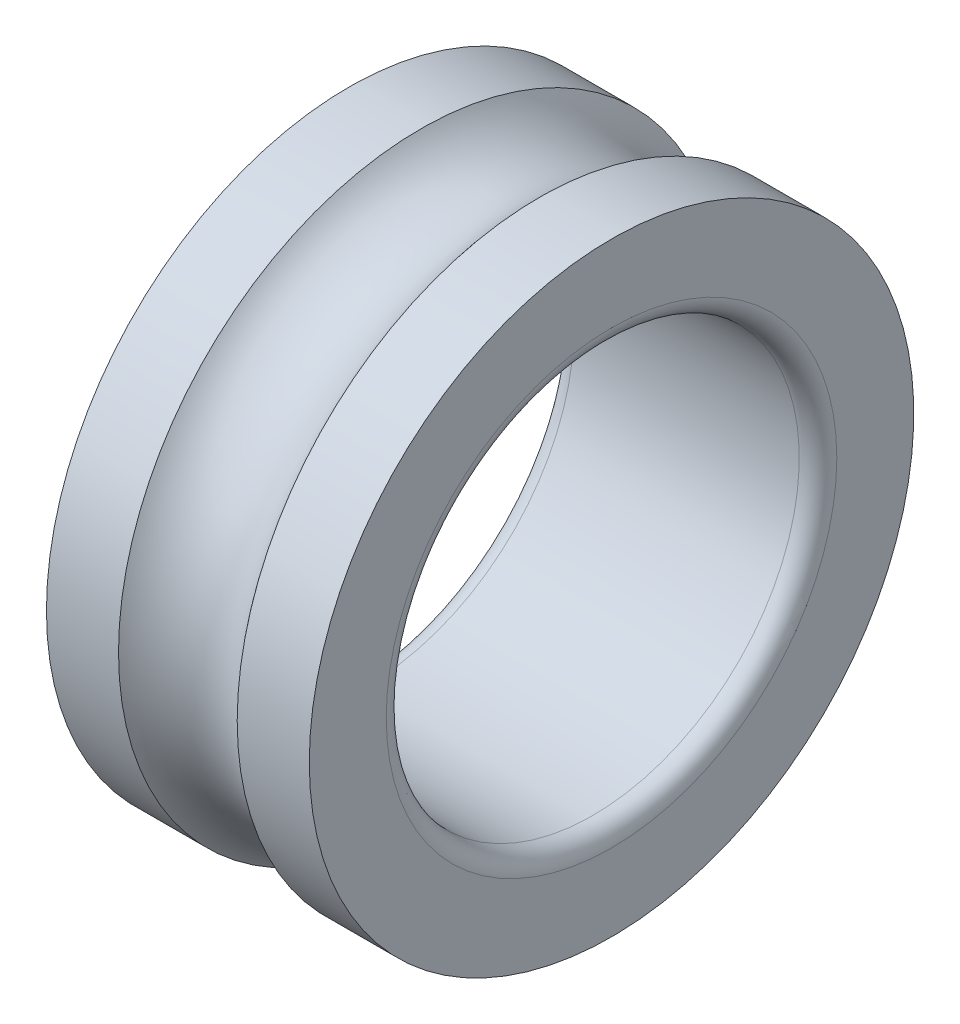
ISO-10303-21;
HEADER;
FILE_DESCRIPTION(('STEP AP214'),'2;1');
FILE_NAME('part.step','',(''),(''),'','','');
FILE_SCHEMA(('AUTOMOTIVE_DESIGN { 1 0 10303 214 1 1 1 1 }'));
ENDSEC;
DATA;
#1=APPLICATION_CONTEXT('core data for automotive mechanical design processes');
#2=APPLICATION_PROTOCOL_DEFINITION('international standard','automotive_design',2000,#1);
#3=PRODUCT_CONTEXT('',#1,'mechanical');
#4=PRODUCT('Part','Part','',(#3));
#5=PRODUCT_RELATED_PRODUCT_CATEGORY('part','',(#4));
#6=PRODUCT_DEFINITION_FORMATION('','',#4);
#7=PRODUCT_DEFINITION_CONTEXT('part definition',#1,'design');
#8=PRODUCT_DEFINITION('design','',#6,#7);
#9=PRODUCT_DEFINITION_SHAPE('','',#8);
#10=(LENGTH_UNIT() NAMED_UNIT(*) SI_UNIT(.MILLI.,.METRE.));
#11=(NAMED_UNIT(*) PLANE_ANGLE_UNIT() SI_UNIT($,.RADIAN.));
#12=(NAMED_UNIT(*) SI_UNIT($,.STERADIAN.) SOLID_ANGLE_UNIT());
#13=UNCERTAINTY_MEASURE_WITH_UNIT(LENGTH_MEASURE(1.E-05),#10,'distance_accuracy_value','');
#14=(GEOMETRIC_REPRESENTATION_CONTEXT(3) GLOBAL_UNCERTAINTY_ASSIGNED_CONTEXT((#13)) GLOBAL_UNIT_ASSIGNED_CONTEXT((#10,
#11,#12)) REPRESENTATION_CONTEXT('',''));
#15=CARTESIAN_POINT('',(0.,0.,0.));
#16=DIRECTION('',(0.,0.,1.));
#17=DIRECTION('',(1.,0.,0.));
#18=AXIS2_PLACEMENT_3D('',#15,#16,#17);
#19=CARTESIAN_POINT('',(0.999999999999224,0.,0.));
#20=DIRECTION('',(-1.,0.,0.));
#21=DIRECTION('',(0.,0.,1.));
#22=AXIS2_PLACEMENT_3D('',#19,#20,#21);
#23=TOROIDAL_SURFACE('',#22,11.9999999999992,0.999999999999224);
#24=CARTESIAN_POINT('',(1.,0.,0.));
#25=DIRECTION('',(-1.,0.,0.));
#26=DIRECTION('',(0.,0.,1.));
#27=AXIS2_PLACEMENT_3D('',#24,#25,#26);
#28=CIRCLE('',#27,11.);
#29=CARTESIAN_POINT('',(1.,0.,11.));
#30=VERTEX_POINT('',#29);
#31=EDGE_CURVE('E10',#30,#30,#28,.T.);
#32=ORIENTED_EDGE('',*,*,#31,.F.);
#33=EDGE_LOOP('',(#32));
#34=FACE_BOUND('',#33,.T.);
#35=CARTESIAN_POINT('',(0.,0.,0.));
#36=DIRECTION('',(-1.,0.,0.));
#37=DIRECTION('',(0.,0.,1.));
#38=AXIS2_PLACEMENT_3D('',#35,#36,#37);
#39=CIRCLE('',#38,12.);
#40=CARTESIAN_POINT('',(0.,0.,12.));
#41=VERTEX_POINT('',#40);
#42=EDGE_CURVE('E63',#41,#41,#39,.T.);
#43=ORIENTED_EDGE('',*,*,#42,.T.);
#44=EDGE_LOOP('',(#43));
#45=FACE_BOUND('',#44,.T.);
#46=ADVANCED_FACE('F35',(#34,#45),#23,.T.);
#47=CARTESIAN_POINT('',(50.,0.,0.));
#48=DIRECTION('',(-1.,0.,0.));
#49=DIRECTION('',(0.,0.,1.));
#50=AXIS2_PLACEMENT_3D('',#47,#48,#49);
#51=CYLINDRICAL_SURFACE('',#50,11.);
#52=CARTESIAN_POINT('',(13.,0.,0.));
#53=DIRECTION('',(-1.,0.,0.));
#54=DIRECTION('',(0.,0.,1.));
#55=AXIS2_PLACEMENT_3D('',#52,#53,#54);
#56=CIRCLE('',#55,11.);
#57=CARTESIAN_POINT('',(13.,0.,11.));
#58=VERTEX_POINT('',#57);
#59=EDGE_CURVE('E41',#58,#58,#56,.T.);
#60=ORIENTED_EDGE('',*,*,#59,.F.);
#61=EDGE_LOOP('',(#60));
#62=FACE_BOUND('',#61,.T.);
#63=ORIENTED_EDGE('',*,*,#31,.T.);
#64=EDGE_LOOP('',(#63));
#65=FACE_BOUND('',#64,.T.);
#66=ADVANCED_FACE('F100',(#62,#65),#51,.F.);
#67=CARTESIAN_POINT('',(13.0000000000015,0.,0.));
#68=DIRECTION('',(-1.,0.,0.));
#69=DIRECTION('',(0.,0.,1.));
#70=AXIS2_PLACEMENT_3D('',#67,#68,#69);
#71=TOROIDAL_SURFACE('',#70,11.9999999999985,0.999999999998453);
#72=CARTESIAN_POINT('',(14.,0.,0.));
#73=DIRECTION('',(-1.,0.,0.));
#74=DIRECTION('',(0.,0.,1.));
#75=AXIS2_PLACEMENT_3D('',#72,#73,#74);
#76=CIRCLE('',#75,12.0000000000015);
#77=CARTESIAN_POINT('',(14.,0.,12.0000000000015));
#78=VERTEX_POINT('',#77);
#79=EDGE_CURVE('E45',#78,#78,#76,.T.);
#80=ORIENTED_EDGE('',*,*,#79,.F.);
#81=EDGE_LOOP('',(#80));
#82=FACE_BOUND('',#81,.T.);
#83=ORIENTED_EDGE('',*,*,#59,.T.);
#84=EDGE_LOOP('',(#83));
#85=FACE_BOUND('',#84,.T.);
#86=ADVANCED_FACE('F95',(#82,#85),#71,.T.);
#87=CARTESIAN_POINT('',(14.,12.0000000000015,0.));
#88=DIRECTION('',(-1.,0.,0.));
#89=DIRECTION('',(0.,0.,1.));
#90=AXIS2_PLACEMENT_3D('',#87,#88,#89);
#91=PLANE('',#90);
#92=CARTESIAN_POINT('',(14.,0.,0.));
#93=DIRECTION('',(-1.,0.,0.));
#94=DIRECTION('',(0.,0.,1.));
#95=AXIS2_PLACEMENT_3D('',#92,#93,#94);
#96=CIRCLE('',#95,16.1);
#97=CARTESIAN_POINT('',(14.,0.,16.1));
#98=VERTEX_POINT('',#97);
#99=EDGE_CURVE('E49',#98,#98,#96,.T.);
#100=ORIENTED_EDGE('',*,*,#99,.F.);
#101=EDGE_LOOP('',(#100));
#102=FACE_BOUND('',#101,.T.);
#103=ORIENTED_EDGE('',*,*,#79,.T.);
#104=EDGE_LOOP('',(#103));
#105=FACE_BOUND('',#104,.T.);
#106=ADVANCED_FACE('F89',(#102,#105),#91,.F.);
#107=CARTESIAN_POINT('',(50.,0.,0.));
#108=DIRECTION('',(-1.,0.,0.));
#109=DIRECTION('',(0.,0.,1.));
#110=AXIS2_PLACEMENT_3D('',#107,#108,#109);
#111=CYLINDRICAL_SURFACE('',#110,16.1);
#112=CARTESIAN_POINT('',(10.161164500623,0.,0.));
#113=DIRECTION('',(-1.,0.,0.));
#114=DIRECTION('',(0.,0.,1.));
#115=AXIS2_PLACEMENT_3D('',#112,#113,#114);
#116=CIRCLE('',#115,16.1);
#117=CARTESIAN_POINT('',(10.161164500623,0.,16.1));
#118=VERTEX_POINT('',#117);
#119=EDGE_CURVE('E54',#118,#118,#116,.T.);
#120=ORIENTED_EDGE('',*,*,#119,.F.);
#121=EDGE_LOOP('',(#120));
#122=FACE_BOUND('',#121,.T.);
#123=ORIENTED_EDGE('',*,*,#99,.T.);
#124=EDGE_LOOP('',(#123));
#125=FACE_BOUND('',#124,.T.);
#126=ADVANCED_FACE('F83',(#122,#125),#111,.T.);
#127=CARTESIAN_POINT('',(6.99999999999995,0.,0.));
#128=DIRECTION('',(-1.,0.,0.));
#129=DIRECTION('',(0.,0.,1.));
#130=AXIS2_PLACEMENT_3D('',#127,#128,#129);
#131=TOROIDAL_SURFACE('',#130,18.4999999999998,3.9689999999998);
#132=CARTESIAN_POINT('',(3.8388354993769,0.,0.));
#133=DIRECTION('',(-1.,0.,0.));
#134=DIRECTION('',(0.,0.,1.));
#135=AXIS2_PLACEMENT_3D('',#132,#133,#134);
#136=CIRCLE('',#135,16.1);
#137=CARTESIAN_POINT('',(3.8388354993769,0.,16.1));
#138=VERTEX_POINT('',#137);
#139=EDGE_CURVE('E57',#138,#138,#136,.T.);
#140=ORIENTED_EDGE('',*,*,#139,.F.);
#141=EDGE_LOOP('',(#140));
#142=FACE_BOUND('',#141,.T.);
#143=ORIENTED_EDGE('',*,*,#119,.T.);
#144=EDGE_LOOP('',(#143));
#145=FACE_BOUND('',#144,.T.);
#146=ADVANCED_FACE('F77',(#142,#145),#131,.F.);
#147=CARTESIAN_POINT('',(50.,0.,0.));
#148=DIRECTION('',(-1.,0.,0.));
#149=DIRECTION('',(0.,0.,1.));
#150=AXIS2_PLACEMENT_3D('',#147,#148,#149);
#151=CYLINDRICAL_SURFACE('',#150,16.1);
#152=CARTESIAN_POINT('',(0.,0.,0.));
#153=DIRECTION('',(-1.,0.,0.));
#154=DIRECTION('',(0.,0.,1.));
#155=AXIS2_PLACEMENT_3D('',#152,#153,#154);
#156=CIRCLE('',#155,16.1);
#157=CARTESIAN_POINT('',(0.,0.,16.1));
#158=VERTEX_POINT('',#157);
#159=EDGE_CURVE('E60',#158,#158,#156,.T.);
#160=ORIENTED_EDGE('',*,*,#159,.F.);
#161=EDGE_LOOP('',(#160));
#162=FACE_BOUND('',#161,.T.);
#163=ORIENTED_EDGE('',*,*,#139,.T.);
#164=EDGE_LOOP('',(#163));
#165=FACE_BOUND('',#164,.T.);
#166=ADVANCED_FACE('F71',(#162,#165),#151,.T.);
#167=CARTESIAN_POINT('',(0.,16.1,0.));
#168=DIRECTION('',(1.,0.,0.));
#169=DIRECTION('',(0.,0.,-1.));
#170=AXIS2_PLACEMENT_3D('',#167,#168,#169);
#171=PLANE('',#170);
#172=ORIENTED_EDGE('',*,*,#42,.F.);
#173=EDGE_LOOP('',(#172));
#174=FACE_BOUND('',#173,.T.);
#175=ORIENTED_EDGE('',*,*,#159,.T.);
#176=EDGE_LOOP('',(#175));
#177=FACE_BOUND('',#176,.T.);
#178=ADVANCED_FACE('F68',(#174,#177),#171,.F.);
#179=CLOSED_SHELL('',(#46,#66,#86,#106,#126,#146,#166,#178));
#180=MANIFOLD_SOLID_BREP('B2',#179);
#181=ADVANCED_BREP_SHAPE_REPRESENTATION('',(#18,#180),#14);
#182=SHAPE_DEFINITION_REPRESENTATION(#9,#181);
ENDSEC;
END-ISO-10303-21;
